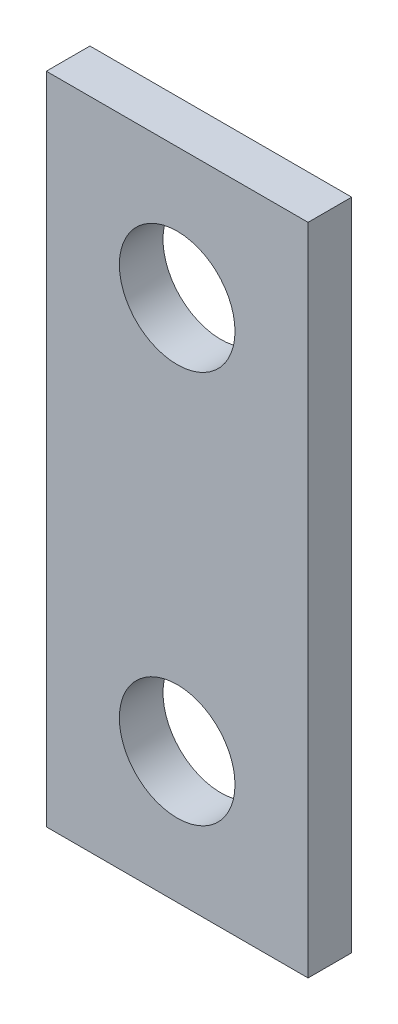
ISO-10303-21;
HEADER;
FILE_DESCRIPTION(('STEP AP214'),'2;1');
FILE_NAME('part.step','',(''),(''),'','','');
FILE_SCHEMA(('AUTOMOTIVE_DESIGN { 1 0 10303 214 1 1 1 1 }'));
ENDSEC;
DATA;
#1=APPLICATION_CONTEXT('core data for automotive mechanical design processes');
#2=APPLICATION_PROTOCOL_DEFINITION('international standard','automotive_design',2000,#1);
#3=PRODUCT_CONTEXT('',#1,'mechanical');
#4=PRODUCT('Part','Part','',(#3));
#5=PRODUCT_RELATED_PRODUCT_CATEGORY('part','',(#4));
#6=PRODUCT_DEFINITION_FORMATION('','',#4);
#7=PRODUCT_DEFINITION_CONTEXT('part definition',#1,'design');
#8=PRODUCT_DEFINITION('design','',#6,#7);
#9=PRODUCT_DEFINITION_SHAPE('','',#8);
#10=(LENGTH_UNIT() NAMED_UNIT(*) SI_UNIT(.MILLI.,.METRE.));
#11=(NAMED_UNIT(*) PLANE_ANGLE_UNIT() SI_UNIT($,.RADIAN.));
#12=(NAMED_UNIT(*) SI_UNIT($,.STERADIAN.) SOLID_ANGLE_UNIT());
#13=UNCERTAINTY_MEASURE_WITH_UNIT(LENGTH_MEASURE(1.E-05),#10,'distance_accuracy_value','');
#14=(GEOMETRIC_REPRESENTATION_CONTEXT(3) GLOBAL_UNCERTAINTY_ASSIGNED_CONTEXT((#13)) GLOBAL_UNIT_ASSIGNED_CONTEXT((#10,
#11,#12)) REPRESENTATION_CONTEXT('',''));
#15=CARTESIAN_POINT('',(0.,0.,0.));
#16=DIRECTION('',(0.,0.,1.));
#17=DIRECTION('',(1.,0.,0.));
#18=AXIS2_PLACEMENT_3D('',#15,#16,#17);
#19=CARTESIAN_POINT('',(5.99999999999999,-15.,-1.99999999999995));
#20=DIRECTION('',(-1.,0.,0.));
#21=DIRECTION('',(0.,0.,-1.));
#22=AXIS2_PLACEMENT_3D('',#19,#20,#21);
#23=PLANE('',#22);
#24=DIRECTION('',(0.,1.,0.));
#25=VECTOR('',#24,1.);
#26=CARTESIAN_POINT('',(5.99999999999999,-15.,0.));
#27=LINE('',#26,#25);
#28=CARTESIAN_POINT('',(5.99999999999999,-15.,0.));
#29=VERTEX_POINT('',#28);
#30=CARTESIAN_POINT('',(5.99999999999999,15.,0.));
#31=VERTEX_POINT('',#30);
#32=EDGE_CURVE('E103',#29,#31,#27,.T.);
#33=ORIENTED_EDGE('',*,*,#32,.F.);
#34=DIRECTION('',(0.,0.,1.));
#35=VECTOR('',#34,1.);
#36=CARTESIAN_POINT('',(5.99999999999999,-15.,-1.99999999999995));
#37=LINE('',#36,#35);
#38=CARTESIAN_POINT('',(5.99999999999999,-15.,-1.99999999999995));
#39=VERTEX_POINT('',#38);
#40=EDGE_CURVE('E102',#39,#29,#37,.T.);
#41=ORIENTED_EDGE('',*,*,#40,.F.);
#42=DIRECTION('',(0.,1.,0.));
#43=VECTOR('',#42,1.);
#44=CARTESIAN_POINT('',(5.99999999999999,-15.,-1.99999999999995));
#45=LINE('',#44,#43);
#46=CARTESIAN_POINT('',(5.99999999999999,15.,-1.99999999999995));
#47=VERTEX_POINT('',#46);
#48=EDGE_CURVE('E96',#39,#47,#45,.T.);
#49=ORIENTED_EDGE('',*,*,#48,.T.);
#50=DIRECTION('',(0.,0.,1.));
#51=VECTOR('',#50,1.);
#52=CARTESIAN_POINT('',(5.99999999999999,15.,-1.99999999999995));
#53=LINE('',#52,#51);
#54=EDGE_CURVE('E11',#47,#31,#53,.T.);
#55=ORIENTED_EDGE('',*,*,#54,.T.);
#56=EDGE_LOOP('',(#33,#41,#49,#55));
#57=FACE_BOUND('',#56,.T.);
#58=ADVANCED_FACE('F39',(#57),#23,.F.);
#59=CARTESIAN_POINT('',(-6.00000000000001,15.,-1.99999999999995));
#60=DIRECTION('',(0.,-1.,0.));
#61=DIRECTION('',(0.,0.,1.));
#62=AXIS2_PLACEMENT_3D('',#59,#60,#61);
#63=PLANE('',#62);
#64=DIRECTION('',(-1.,0.,0.));
#65=VECTOR('',#64,1.);
#66=CARTESIAN_POINT('',(-6.00000000000001,15.,0.));
#67=LINE('',#66,#65);
#68=CARTESIAN_POINT('',(-6.00000000000001,15.,0.));
#69=VERTEX_POINT('',#68);
#70=EDGE_CURVE('E105',#31,#69,#67,.T.);
#71=ORIENTED_EDGE('',*,*,#70,.F.);
#72=ORIENTED_EDGE('',*,*,#54,.F.);
#73=DIRECTION('',(-1.,0.,0.));
#74=VECTOR('',#73,1.);
#75=CARTESIAN_POINT('',(-6.00000000000001,15.,-1.99999999999995));
#76=LINE('',#75,#74);
#77=CARTESIAN_POINT('',(-6.00000000000001,15.,-1.99999999999995));
#78=VERTEX_POINT('',#77);
#79=EDGE_CURVE('E80',#47,#78,#76,.T.);
#80=ORIENTED_EDGE('',*,*,#79,.T.);
#81=DIRECTION('',(0.,0.,1.));
#82=VECTOR('',#81,1.);
#83=CARTESIAN_POINT('',(-6.00000000000001,15.,-1.99999999999995));
#84=LINE('',#83,#82);
#85=EDGE_CURVE('E47',#78,#69,#84,.T.);
#86=ORIENTED_EDGE('',*,*,#85,.T.);
#87=EDGE_LOOP('',(#71,#72,#80,#86));
#88=FACE_BOUND('',#87,.T.);
#89=ADVANCED_FACE('F94',(#88),#63,.F.);
#90=CARTESIAN_POINT('',(-6.,-15.,-1.99999999999995));
#91=DIRECTION('',(1.,0.,0.));
#92=DIRECTION('',(0.,0.,1.));
#93=AXIS2_PLACEMENT_3D('',#90,#91,#92);
#94=PLANE('',#93);
#95=DIRECTION('',(0.,-1.,0.));
#96=VECTOR('',#95,1.);
#97=CARTESIAN_POINT('',(-6.,-15.,0.));
#98=LINE('',#97,#96);
#99=CARTESIAN_POINT('',(-6.,-15.,0.));
#100=VERTEX_POINT('',#99);
#101=EDGE_CURVE('E90',#69,#100,#98,.T.);
#102=ORIENTED_EDGE('',*,*,#101,.F.);
#103=ORIENTED_EDGE('',*,*,#85,.F.);
#104=DIRECTION('',(0.,-1.,0.));
#105=VECTOR('',#104,1.);
#106=CARTESIAN_POINT('',(-6.,-15.,-1.99999999999995));
#107=LINE('',#106,#105);
#108=CARTESIAN_POINT('',(-6.,-15.,-1.99999999999995));
#109=VERTEX_POINT('',#108);
#110=EDGE_CURVE('E83',#78,#109,#107,.T.);
#111=ORIENTED_EDGE('',*,*,#110,.T.);
#112=DIRECTION('',(0.,0.,1.));
#113=VECTOR('',#112,1.);
#114=CARTESIAN_POINT('',(-6.,-15.,-1.99999999999995));
#115=LINE('',#114,#113);
#116=EDGE_CURVE('E93',#109,#100,#115,.T.);
#117=ORIENTED_EDGE('',*,*,#116,.T.);
#118=EDGE_LOOP('',(#102,#103,#111,#117));
#119=FACE_BOUND('',#118,.T.);
#120=ADVANCED_FACE('F89',(#119),#94,.F.);
#121=CARTESIAN_POINT('',(-6.,-15.,-1.99999999999995));
#122=DIRECTION('',(0.,1.,0.));
#123=DIRECTION('',(0.,0.,-1.));
#124=AXIS2_PLACEMENT_3D('',#121,#122,#123);
#125=PLANE('',#124);
#126=DIRECTION('',(1.,0.,0.));
#127=VECTOR('',#126,1.);
#128=CARTESIAN_POINT('',(-6.,-15.,0.));
#129=LINE('',#128,#127);
#130=EDGE_CURVE('E69',#100,#29,#129,.T.);
#131=ORIENTED_EDGE('',*,*,#130,.F.);
#132=ORIENTED_EDGE('',*,*,#116,.F.);
#133=DIRECTION('',(1.,0.,0.));
#134=VECTOR('',#133,1.);
#135=CARTESIAN_POINT('',(-6.,-15.,-1.99999999999995));
#136=LINE('',#135,#134);
#137=EDGE_CURVE('E55',#109,#39,#136,.T.);
#138=ORIENTED_EDGE('',*,*,#137,.T.);
#139=ORIENTED_EDGE('',*,*,#40,.T.);
#140=EDGE_LOOP('',(#131,#132,#138,#139));
#141=FACE_BOUND('',#140,.T.);
#142=ADVANCED_FACE('F115',(#141),#125,.F.);
#143=CARTESIAN_POINT('',(0.,0.,-2.));
#144=DIRECTION('',(0.,0.,1.));
#145=DIRECTION('',(-1.,0.,0.));
#146=AXIS2_PLACEMENT_3D('',#143,#144,#145);
#147=PLANE('',#146);
#148=CARTESIAN_POINT('',(0.,-8.99999999999994,-1.99999999999995));
#149=DIRECTION('',(0.,0.,1.));
#150=DIRECTION('',(1.,0.,0.));
#151=AXIS2_PLACEMENT_3D('',#148,#149,#150);
#152=CIRCLE('',#151,2.65);
#153=CARTESIAN_POINT('',(2.65,-8.99999999999994,-1.99999999999995));
#154=VERTEX_POINT('',#153);
#155=EDGE_CURVE('E185',#154,#154,#152,.T.);
#156=ORIENTED_EDGE('',*,*,#155,.T.);
#157=EDGE_LOOP('',(#156));
#158=FACE_BOUND('',#157,.T.);
#159=CARTESIAN_POINT('',(0.,9.00000000000001,-1.99999999999995));
#160=DIRECTION('',(0.,0.,1.));
#161=DIRECTION('',(1.,0.,0.));
#162=AXIS2_PLACEMENT_3D('',#159,#160,#161);
#163=CIRCLE('',#162,2.65);
#164=CARTESIAN_POINT('',(2.65,9.00000000000001,-1.99999999999995));
#165=VERTEX_POINT('',#164);
#166=EDGE_CURVE('E189',#165,#165,#163,.T.);
#167=ORIENTED_EDGE('',*,*,#166,.T.);
#168=EDGE_LOOP('',(#167));
#169=FACE_BOUND('',#168,.T.);
#170=ORIENTED_EDGE('',*,*,#48,.F.);
#171=ORIENTED_EDGE('',*,*,#137,.F.);
#172=ORIENTED_EDGE('',*,*,#110,.F.);
#173=ORIENTED_EDGE('',*,*,#79,.F.);
#174=EDGE_LOOP('',(#170,#171,#172,#173));
#175=FACE_BOUND('',#174,.T.);
#176=ADVANCED_FACE('F85',(#158,#169,#175),#147,.F.);
#177=CARTESIAN_POINT('',(0.,0.,0.));
#178=DIRECTION('',(0.,0.,1.));
#179=DIRECTION('',(-1.,0.,0.));
#180=AXIS2_PLACEMENT_3D('',#177,#178,#179);
#181=PLANE('',#180);
#182=CARTESIAN_POINT('',(0.,-9.00000000000001,0.));
#183=DIRECTION('',(0.,0.,-1.));
#184=DIRECTION('',(-1.,0.,0.));
#185=AXIS2_PLACEMENT_3D('',#182,#183,#184);
#186=CIRCLE('',#185,2.65);
#187=CARTESIAN_POINT('',(-2.65,-9.00000000000001,0.));
#188=VERTEX_POINT('',#187);
#189=EDGE_CURVE('E188',#188,#188,#186,.T.);
#190=ORIENTED_EDGE('',*,*,#189,.T.);
#191=EDGE_LOOP('',(#190));
#192=FACE_BOUND('',#191,.T.);
#193=CARTESIAN_POINT('',(0.,9.00000000000004,0.));
#194=DIRECTION('',(0.,0.,-1.));
#195=DIRECTION('',(-1.,0.,0.));
#196=AXIS2_PLACEMENT_3D('',#193,#194,#195);
#197=CIRCLE('',#196,2.65);
#198=CARTESIAN_POINT('',(-2.65,9.00000000000004,0.));
#199=VERTEX_POINT('',#198);
#200=EDGE_CURVE('E106',#199,#199,#197,.T.);
#201=ORIENTED_EDGE('',*,*,#200,.T.);
#202=EDGE_LOOP('',(#201));
#203=FACE_BOUND('',#202,.T.);
#204=ORIENTED_EDGE('',*,*,#32,.T.);
#205=ORIENTED_EDGE('',*,*,#70,.T.);
#206=ORIENTED_EDGE('',*,*,#101,.T.);
#207=ORIENTED_EDGE('',*,*,#130,.T.);
#208=EDGE_LOOP('',(#204,#205,#206,#207));
#209=FACE_BOUND('',#208,.T.);
#210=ADVANCED_FACE('F111',(#192,#203,#209),#181,.T.);
#211=CARTESIAN_POINT('',(0.,9.00000000000001,-1.99999999999995));
#212=DIRECTION('',(0.,0.,-1.));
#213=DIRECTION('',(1.,0.,0.));
#214=AXIS2_PLACEMENT_3D('',#211,#212,#213);
#215=CYLINDRICAL_SURFACE('',#214,2.65);
#216=ORIENTED_EDGE('',*,*,#166,.F.);
#217=EDGE_LOOP('',(#216));
#218=FACE_BOUND('',#217,.T.);
#219=ORIENTED_EDGE('',*,*,#200,.F.);
#220=EDGE_LOOP('',(#219));
#221=FACE_BOUND('',#220,.T.);
#222=ADVANCED_FACE('F155',(#218,#221),#215,.F.);
#223=CARTESIAN_POINT('',(0.,-8.99999999999994,-1.99999999999995));
#224=DIRECTION('',(0.,0.,-1.));
#225=DIRECTION('',(1.,0.,0.));
#226=AXIS2_PLACEMENT_3D('',#223,#224,#225);
#227=CYLINDRICAL_SURFACE('',#226,2.65);
#228=ORIENTED_EDGE('',*,*,#155,.F.);
#229=EDGE_LOOP('',(#228));
#230=FACE_BOUND('',#229,.T.);
#231=ORIENTED_EDGE('',*,*,#189,.F.);
#232=EDGE_LOOP('',(#231));
#233=FACE_BOUND('',#232,.T.);
#234=ADVANCED_FACE('F165',(#230,#233),#227,.F.);
#235=CLOSED_SHELL('',(#58,#89,#120,#142,#176,#210,#222,#234));
#236=MANIFOLD_SOLID_BREP('B2',#235);
#237=ADVANCED_BREP_SHAPE_REPRESENTATION('',(#18,#236),#14);
#238=SHAPE_DEFINITION_REPRESENTATION(#9,#237);
ENDSEC;
END-ISO-10303-21;
